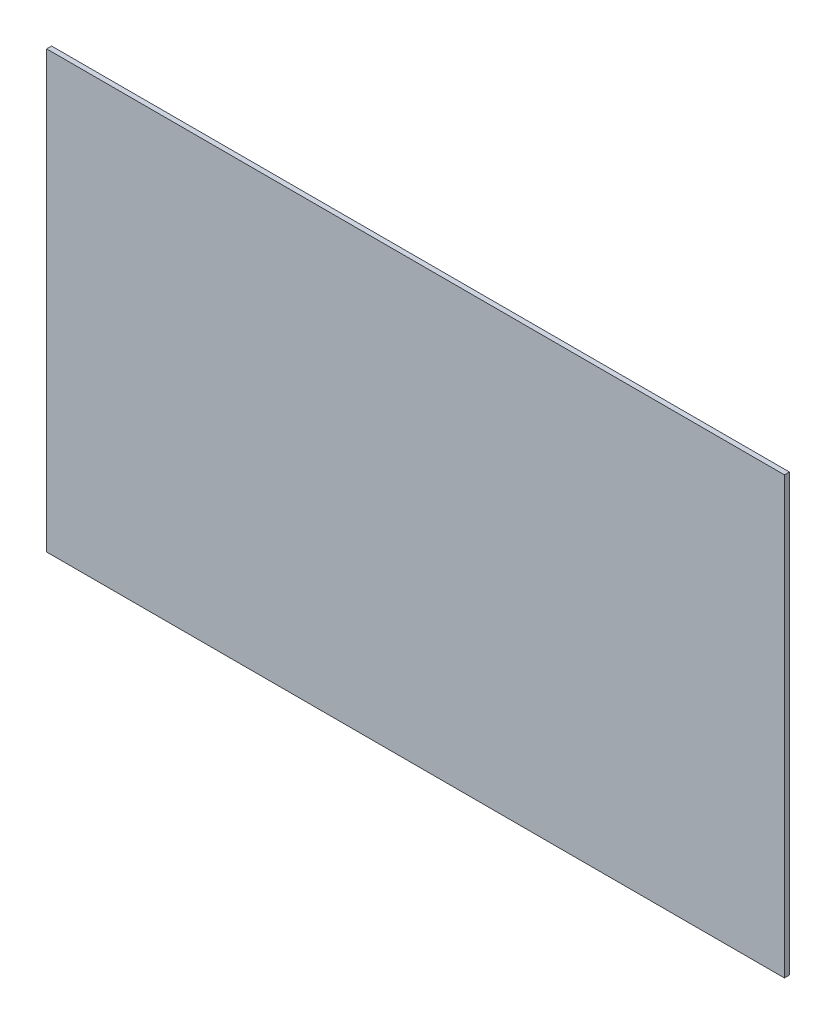
ISO-10303-21;
HEADER;
FILE_DESCRIPTION(('STEP AP214'),'2;1');
FILE_NAME('part.step','',(''),(''),'','','');
FILE_SCHEMA(('AUTOMOTIVE_DESIGN { 1 0 10303 214 1 1 1 1 }'));
ENDSEC;
DATA;
#1=APPLICATION_CONTEXT('core data for automotive mechanical design processes');
#2=APPLICATION_PROTOCOL_DEFINITION('international standard','automotive_design',2000,#1);
#3=PRODUCT_CONTEXT('',#1,'mechanical');
#4=PRODUCT('Part','Part','',(#3));
#5=PRODUCT_RELATED_PRODUCT_CATEGORY('part','',(#4));
#6=PRODUCT_DEFINITION_FORMATION('','',#4);
#7=PRODUCT_DEFINITION_CONTEXT('part definition',#1,'design');
#8=PRODUCT_DEFINITION('design','',#6,#7);
#9=PRODUCT_DEFINITION_SHAPE('','',#8);
#10=(LENGTH_UNIT() NAMED_UNIT(*) SI_UNIT(.MILLI.,.METRE.));
#11=(NAMED_UNIT(*) PLANE_ANGLE_UNIT() SI_UNIT($,.RADIAN.));
#12=(NAMED_UNIT(*) SI_UNIT($,.STERADIAN.) SOLID_ANGLE_UNIT());
#13=UNCERTAINTY_MEASURE_WITH_UNIT(LENGTH_MEASURE(1.E-05),#10,'distance_accuracy_value','');
#14=(GEOMETRIC_REPRESENTATION_CONTEXT(3) GLOBAL_UNCERTAINTY_ASSIGNED_CONTEXT((#13)) GLOBAL_UNIT_ASSIGNED_CONTEXT((#10,
#11,#12)) REPRESENTATION_CONTEXT('',''));
#15=CARTESIAN_POINT('',(0.,0.,0.));
#16=DIRECTION('',(0.,0.,1.));
#17=DIRECTION('',(1.,0.,0.));
#18=AXIS2_PLACEMENT_3D('',#15,#16,#17);
#19=CARTESIAN_POINT('',(0.,0.,0.));
#20=DIRECTION('',(0.,0.,1.));
#21=DIRECTION('',(1.,0.,0.));
#22=AXIS2_PLACEMENT_3D('',#19,#20,#21);
#23=PLANE('',#22);
#24=DIRECTION('',(-1.,0.,0.));
#25=VECTOR('',#24,1.);
#26=CARTESIAN_POINT('',(372.5,-220.,0.));
#27=LINE('',#26,#25);
#28=CARTESIAN_POINT('',(372.5,-220.,0.));
#29=VERTEX_POINT('',#28);
#30=CARTESIAN_POINT('',(-372.5,-220.,0.));
#31=VERTEX_POINT('',#30);
#32=EDGE_CURVE('E17',#29,#31,#27,.T.);
#33=ORIENTED_EDGE('',*,*,#32,.T.);
#34=DIRECTION('',(0.,1.,0.));
#35=VECTOR('',#34,1.);
#36=CARTESIAN_POINT('',(-372.5,-220.,0.));
#37=LINE('',#36,#35);
#38=CARTESIAN_POINT('',(-372.5,220.,0.));
#39=VERTEX_POINT('',#38);
#40=EDGE_CURVE('E109',#31,#39,#37,.T.);
#41=ORIENTED_EDGE('',*,*,#40,.T.);
#42=DIRECTION('',(1.,0.,0.));
#43=VECTOR('',#42,1.);
#44=CARTESIAN_POINT('',(-372.5,220.,0.));
#45=LINE('',#44,#43);
#46=CARTESIAN_POINT('',(372.5,220.,0.));
#47=VERTEX_POINT('',#46);
#48=EDGE_CURVE('E61',#39,#47,#45,.T.);
#49=ORIENTED_EDGE('',*,*,#48,.T.);
#50=DIRECTION('',(0.,-1.,0.));
#51=VECTOR('',#50,1.);
#52=CARTESIAN_POINT('',(372.5,220.,0.));
#53=LINE('',#52,#51);
#54=EDGE_CURVE('E77',#47,#29,#53,.T.);
#55=ORIENTED_EDGE('',*,*,#54,.T.);
#56=EDGE_LOOP('',(#33,#41,#49,#55));
#57=FACE_BOUND('',#56,.T.);
#58=ADVANCED_FACE('F14',(#57),#23,.F.);
#59=CARTESIAN_POINT('',(0.,0.,5.));
#60=DIRECTION('',(0.,0.,1.));
#61=DIRECTION('',(1.,0.,0.));
#62=AXIS2_PLACEMENT_3D('',#59,#60,#61);
#63=PLANE('',#62);
#64=DIRECTION('',(1.,0.,0.));
#65=VECTOR('',#64,1.);
#66=CARTESIAN_POINT('',(372.5,-220.,5.));
#67=LINE('',#66,#65);
#68=CARTESIAN_POINT('',(-372.5,-220.,5.));
#69=VERTEX_POINT('',#68);
#70=CARTESIAN_POINT('',(372.5,-220.,5.));
#71=VERTEX_POINT('',#70);
#72=EDGE_CURVE('E9',#69,#71,#67,.T.);
#73=ORIENTED_EDGE('',*,*,#72,.T.);
#74=DIRECTION('',(0.,1.,0.));
#75=VECTOR('',#74,1.);
#76=CARTESIAN_POINT('',(372.5,220.,5.));
#77=LINE('',#76,#75);
#78=CARTESIAN_POINT('',(372.5,220.,5.));
#79=VERTEX_POINT('',#78);
#80=EDGE_CURVE('E80',#71,#79,#77,.T.);
#81=ORIENTED_EDGE('',*,*,#80,.T.);
#82=DIRECTION('',(-1.,0.,0.));
#83=VECTOR('',#82,1.);
#84=CARTESIAN_POINT('',(-372.5,220.,5.));
#85=LINE('',#84,#83);
#86=CARTESIAN_POINT('',(-372.5,220.,5.));
#87=VERTEX_POINT('',#86);
#88=EDGE_CURVE('E70',#79,#87,#85,.T.);
#89=ORIENTED_EDGE('',*,*,#88,.T.);
#90=DIRECTION('',(0.,-1.,0.));
#91=VECTOR('',#90,1.);
#92=CARTESIAN_POINT('',(-372.5,-220.,5.));
#93=LINE('',#92,#91);
#94=EDGE_CURVE('E101',#87,#69,#93,.T.);
#95=ORIENTED_EDGE('',*,*,#94,.T.);
#96=EDGE_LOOP('',(#73,#81,#89,#95));
#97=FACE_BOUND('',#96,.T.);
#98=ADVANCED_FACE('F81',(#97),#63,.T.);
#99=CARTESIAN_POINT('',(-372.5,-220.,0.));
#100=DIRECTION('',(0.,-1.,0.));
#101=DIRECTION('',(0.,0.,-1.));
#102=AXIS2_PLACEMENT_3D('',#99,#100,#101);
#103=PLANE('',#102);
#104=ORIENTED_EDGE('',*,*,#32,.F.);
#105=DIRECTION('',(0.,0.,1.));
#106=VECTOR('',#105,1.);
#107=CARTESIAN_POINT('',(372.5,-220.,0.));
#108=LINE('',#107,#106);
#109=EDGE_CURVE('E83',#29,#71,#108,.T.);
#110=ORIENTED_EDGE('',*,*,#109,.T.);
#111=ORIENTED_EDGE('',*,*,#72,.F.);
#112=DIRECTION('',(0.,0.,1.));
#113=VECTOR('',#112,1.);
#114=CARTESIAN_POINT('',(-372.5,-220.,0.));
#115=LINE('',#114,#113);
#116=EDGE_CURVE('E103',#31,#69,#115,.T.);
#117=ORIENTED_EDGE('',*,*,#116,.F.);
#118=EDGE_LOOP('',(#104,#110,#111,#117));
#119=FACE_BOUND('',#118,.T.);
#120=ADVANCED_FACE('F135',(#119),#103,.T.);
#121=CARTESIAN_POINT('',(372.5,-220.,0.));
#122=DIRECTION('',(1.,0.,0.));
#123=DIRECTION('',(0.,1.,0.));
#124=AXIS2_PLACEMENT_3D('',#121,#122,#123);
#125=PLANE('',#124);
#126=ORIENTED_EDGE('',*,*,#54,.F.);
#127=DIRECTION('',(0.,0.,1.));
#128=VECTOR('',#127,1.);
#129=CARTESIAN_POINT('',(372.5,220.,0.));
#130=LINE('',#129,#128);
#131=EDGE_CURVE('E85',#47,#79,#130,.T.);
#132=ORIENTED_EDGE('',*,*,#131,.T.);
#133=ORIENTED_EDGE('',*,*,#80,.F.);
#134=ORIENTED_EDGE('',*,*,#109,.F.);
#135=EDGE_LOOP('',(#126,#132,#133,#134));
#136=FACE_BOUND('',#135,.T.);
#137=ADVANCED_FACE('F86',(#136),#125,.T.);
#138=CARTESIAN_POINT('',(372.5,220.,0.));
#139=DIRECTION('',(0.,1.,0.));
#140=DIRECTION('',(1.,0.,0.));
#141=AXIS2_PLACEMENT_3D('',#138,#139,#140);
#142=PLANE('',#141);
#143=ORIENTED_EDGE('',*,*,#48,.F.);
#144=DIRECTION('',(0.,0.,1.));
#145=VECTOR('',#144,1.);
#146=CARTESIAN_POINT('',(-372.5,220.,0.));
#147=LINE('',#146,#145);
#148=EDGE_CURVE('E90',#39,#87,#147,.T.);
#149=ORIENTED_EDGE('',*,*,#148,.T.);
#150=ORIENTED_EDGE('',*,*,#88,.F.);
#151=ORIENTED_EDGE('',*,*,#131,.F.);
#152=EDGE_LOOP('',(#143,#149,#150,#151));
#153=FACE_BOUND('',#152,.T.);
#154=ADVANCED_FACE('F89',(#153),#142,.T.);
#155=CARTESIAN_POINT('',(-372.5,220.,0.));
#156=DIRECTION('',(-1.,0.,0.));
#157=DIRECTION('',(0.,0.,1.));
#158=AXIS2_PLACEMENT_3D('',#155,#156,#157);
#159=PLANE('',#158);
#160=ORIENTED_EDGE('',*,*,#40,.F.);
#161=ORIENTED_EDGE('',*,*,#116,.T.);
#162=ORIENTED_EDGE('',*,*,#94,.F.);
#163=ORIENTED_EDGE('',*,*,#148,.F.);
#164=EDGE_LOOP('',(#160,#161,#162,#163));
#165=FACE_BOUND('',#164,.T.);
#166=ADVANCED_FACE('F122',(#165),#159,.T.);
#167=CLOSED_SHELL('',(#58,#98,#120,#137,#154,#166));
#168=MANIFOLD_SOLID_BREP('B1',#167);
#169=ADVANCED_BREP_SHAPE_REPRESENTATION('',(#18,#168),#14);
#170=SHAPE_DEFINITION_REPRESENTATION(#9,#169);
ENDSEC;
END-ISO-10303-21;
